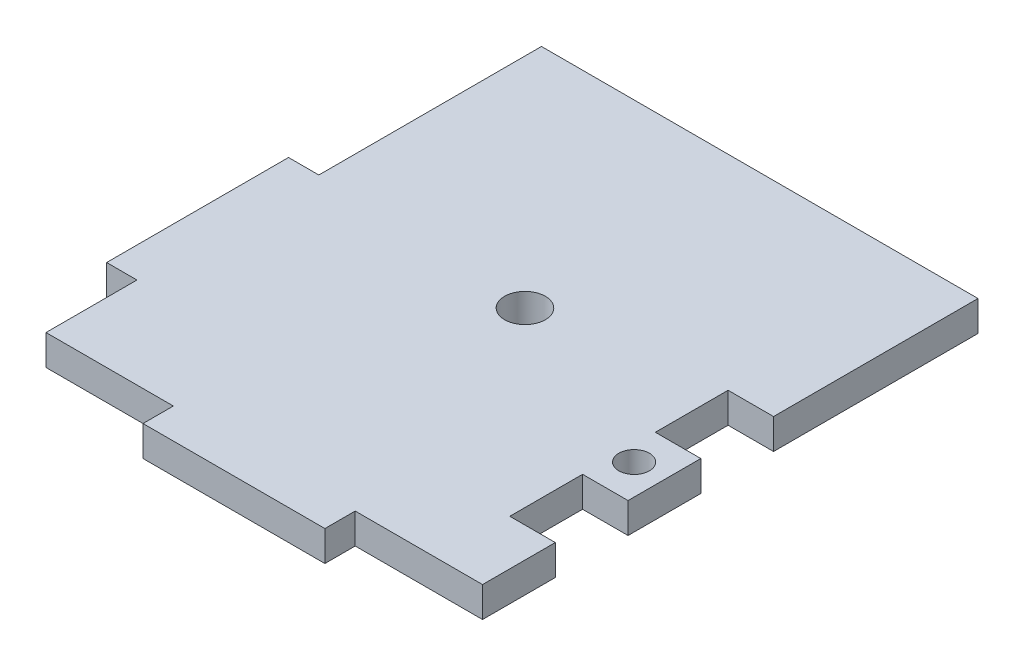
ISO-10303-21;
HEADER;
FILE_DESCRIPTION(('STEP AP214'),'2;1');
FILE_NAME('part.step','',(''),(''),'','','');
FILE_SCHEMA(('AUTOMOTIVE_DESIGN { 1 0 10303 214 1 1 1 1 }'));
ENDSEC;
DATA;
#1=APPLICATION_CONTEXT('core data for automotive mechanical design processes');
#2=APPLICATION_PROTOCOL_DEFINITION('international standard','automotive_design',2000,#1);
#3=PRODUCT_CONTEXT('',#1,'mechanical');
#4=PRODUCT('Part','Part','',(#3));
#5=PRODUCT_RELATED_PRODUCT_CATEGORY('part','',(#4));
#6=PRODUCT_DEFINITION_FORMATION('','',#4);
#7=PRODUCT_DEFINITION_CONTEXT('part definition',#1,'design');
#8=PRODUCT_DEFINITION('design','',#6,#7);
#9=PRODUCT_DEFINITION_SHAPE('','',#8);
#10=(LENGTH_UNIT() NAMED_UNIT(*) SI_UNIT(.MILLI.,.METRE.));
#11=(NAMED_UNIT(*) PLANE_ANGLE_UNIT() SI_UNIT($,.RADIAN.));
#12=(NAMED_UNIT(*) SI_UNIT($,.STERADIAN.) SOLID_ANGLE_UNIT());
#13=UNCERTAINTY_MEASURE_WITH_UNIT(LENGTH_MEASURE(1.E-05),#10,'distance_accuracy_value','');
#14=(GEOMETRIC_REPRESENTATION_CONTEXT(3) GLOBAL_UNCERTAINTY_ASSIGNED_CONTEXT((#13)) GLOBAL_UNIT_ASSIGNED_CONTEXT((#10,
#11,#12)) REPRESENTATION_CONTEXT('',''));
#15=CARTESIAN_POINT('',(0.,0.,0.));
#16=DIRECTION('',(0.,0.,1.));
#17=DIRECTION('',(1.,0.,0.));
#18=AXIS2_PLACEMENT_3D('',#15,#16,#17);
#19=CARTESIAN_POINT('',(0.,3.175,-9.525));
#20=DIRECTION('',(1.,0.,0.));
#21=DIRECTION('',(0.,0.,-1.));
#22=AXIS2_PLACEMENT_3D('',#19,#20,#21);
#23=PLANE('',#22);
#24=DIRECTION('',(0.,0.,1.));
#25=VECTOR('',#24,1.);
#26=CARTESIAN_POINT('',(0.,0.,-9.525));
#27=LINE('',#26,#25);
#28=CARTESIAN_POINT('',(0.,0.,-9.525));
#29=VERTEX_POINT('',#28);
#30=CARTESIAN_POINT('',(0.,0.,0.));
#31=VERTEX_POINT('',#30);
#32=EDGE_CURVE('E201',#29,#31,#27,.T.);
#33=ORIENTED_EDGE('',*,*,#32,.T.);
#34=DIRECTION('',(0.,-1.,0.));
#35=VECTOR('',#34,1.);
#36=CARTESIAN_POINT('',(0.,3.175,0.));
#37=LINE('',#36,#35);
#38=CARTESIAN_POINT('',(0.,3.175,0.));
#39=VERTEX_POINT('',#38);
#40=EDGE_CURVE('E11',#39,#31,#37,.T.);
#41=ORIENTED_EDGE('',*,*,#40,.F.);
#42=DIRECTION('',(0.,0.,1.));
#43=VECTOR('',#42,1.);
#44=CARTESIAN_POINT('',(0.,3.175,-9.525));
#45=LINE('',#44,#43);
#46=CARTESIAN_POINT('',(0.,3.175,-9.525));
#47=VERTEX_POINT('',#46);
#48=EDGE_CURVE('E240',#47,#39,#45,.T.);
#49=ORIENTED_EDGE('',*,*,#48,.F.);
#50=DIRECTION('',(0.,-1.,0.));
#51=VECTOR('',#50,1.);
#52=CARTESIAN_POINT('',(0.,3.175,-9.525));
#53=LINE('',#52,#51);
#54=EDGE_CURVE('E197',#47,#29,#53,.T.);
#55=ORIENTED_EDGE('',*,*,#54,.T.);
#56=EDGE_LOOP('',(#33,#41,#49,#55));
#57=FACE_BOUND('',#56,.T.);
#58=ADVANCED_FACE('F33',(#57),#23,.F.);
#59=CARTESIAN_POINT('',(0.,3.175,0.));
#60=DIRECTION('',(0.,0.,-1.));
#61=DIRECTION('',(-1.,0.,0.));
#62=AXIS2_PLACEMENT_3D('',#59,#60,#61);
#63=PLANE('',#62);
#64=DIRECTION('',(1.,0.,0.));
#65=VECTOR('',#64,1.);
#66=CARTESIAN_POINT('',(0.,0.,0.));
#67=LINE('',#66,#65);
#68=CARTESIAN_POINT('',(13.335,0.,0.));
#69=VERTEX_POINT('',#68);
#70=EDGE_CURVE('E204',#31,#69,#67,.T.);
#71=ORIENTED_EDGE('',*,*,#70,.T.);
#72=DIRECTION('',(0.,-1.,0.));
#73=VECTOR('',#72,1.);
#74=CARTESIAN_POINT('',(13.335,3.175,0.));
#75=LINE('',#74,#73);
#76=CARTESIAN_POINT('',(13.335,3.175,0.));
#77=VERTEX_POINT('',#76);
#78=EDGE_CURVE('E41',#77,#69,#75,.T.);
#79=ORIENTED_EDGE('',*,*,#78,.F.);
#80=DIRECTION('',(1.,0.,0.));
#81=VECTOR('',#80,1.);
#82=CARTESIAN_POINT('',(0.,3.175,0.));
#83=LINE('',#82,#81);
#84=EDGE_CURVE('E128',#39,#77,#83,.T.);
#85=ORIENTED_EDGE('',*,*,#84,.F.);
#86=ORIENTED_EDGE('',*,*,#40,.T.);
#87=EDGE_LOOP('',(#71,#79,#85,#86));
#88=FACE_BOUND('',#87,.T.);
#89=ADVANCED_FACE('F359',(#88),#63,.F.);
#90=CARTESIAN_POINT('',(13.335,3.175,0.));
#91=DIRECTION('',(1.,0.,0.));
#92=DIRECTION('',(0.,0.,-1.));
#93=AXIS2_PLACEMENT_3D('',#90,#91,#92);
#94=PLANE('',#93);
#95=DIRECTION('',(0.,0.,1.));
#96=VECTOR('',#95,1.);
#97=CARTESIAN_POINT('',(13.335,0.,0.));
#98=LINE('',#97,#96);
#99=CARTESIAN_POINT('',(13.335,0.,3.175));
#100=VERTEX_POINT('',#99);
#101=EDGE_CURVE('E207',#69,#100,#98,.T.);
#102=ORIENTED_EDGE('',*,*,#101,.T.);
#103=DIRECTION('',(0.,-1.,0.));
#104=VECTOR('',#103,1.);
#105=CARTESIAN_POINT('',(13.335,3.175,3.175));
#106=LINE('',#105,#104);
#107=CARTESIAN_POINT('',(13.335,3.175,3.175));
#108=VERTEX_POINT('',#107);
#109=EDGE_CURVE('E283',#108,#100,#106,.T.);
#110=ORIENTED_EDGE('',*,*,#109,.F.);
#111=DIRECTION('',(0.,0.,1.));
#112=VECTOR('',#111,1.);
#113=CARTESIAN_POINT('',(13.335,3.175,0.));
#114=LINE('',#113,#112);
#115=EDGE_CURVE('E291',#77,#108,#114,.T.);
#116=ORIENTED_EDGE('',*,*,#115,.F.);
#117=ORIENTED_EDGE('',*,*,#78,.T.);
#118=EDGE_LOOP('',(#102,#110,#116,#117));
#119=FACE_BOUND('',#118,.T.);
#120=ADVANCED_FACE('F289',(#119),#94,.F.);
#121=CARTESIAN_POINT('',(13.335,3.175,3.175));
#122=DIRECTION('',(0.,0.,-1.));
#123=DIRECTION('',(-1.,0.,0.));
#124=AXIS2_PLACEMENT_3D('',#121,#122,#123);
#125=PLANE('',#124);
#126=DIRECTION('',(1.,0.,0.));
#127=VECTOR('',#126,1.);
#128=CARTESIAN_POINT('',(13.335,0.,3.175));
#129=LINE('',#128,#127);
#130=CARTESIAN_POINT('',(32.385,0.,3.175));
#131=VERTEX_POINT('',#130);
#132=EDGE_CURVE('E209',#100,#131,#129,.T.);
#133=ORIENTED_EDGE('',*,*,#132,.T.);
#134=DIRECTION('',(0.,-1.,0.));
#135=VECTOR('',#134,1.);
#136=CARTESIAN_POINT('',(32.385,3.175,3.175));
#137=LINE('',#136,#135);
#138=CARTESIAN_POINT('',(32.385,3.175,3.175));
#139=VERTEX_POINT('',#138);
#140=EDGE_CURVE('E280',#139,#131,#137,.T.);
#141=ORIENTED_EDGE('',*,*,#140,.F.);
#142=DIRECTION('',(1.,0.,0.));
#143=VECTOR('',#142,1.);
#144=CARTESIAN_POINT('',(13.335,3.175,3.175));
#145=LINE('',#144,#143);
#146=EDGE_CURVE('E309',#108,#139,#145,.T.);
#147=ORIENTED_EDGE('',*,*,#146,.F.);
#148=ORIENTED_EDGE('',*,*,#109,.T.);
#149=EDGE_LOOP('',(#133,#141,#147,#148));
#150=FACE_BOUND('',#149,.T.);
#151=ADVANCED_FACE('F300',(#150),#125,.F.);
#152=CARTESIAN_POINT('',(32.385,3.175,3.175));
#153=DIRECTION('',(-1.,0.,0.));
#154=DIRECTION('',(0.,0.,1.));
#155=AXIS2_PLACEMENT_3D('',#152,#153,#154);
#156=PLANE('',#155);
#157=DIRECTION('',(0.,0.,-1.));
#158=VECTOR('',#157,1.);
#159=CARTESIAN_POINT('',(32.385,0.,3.175));
#160=LINE('',#159,#158);
#161=CARTESIAN_POINT('',(32.385,0.,0.));
#162=VERTEX_POINT('',#161);
#163=EDGE_CURVE('E211',#131,#162,#160,.T.);
#164=ORIENTED_EDGE('',*,*,#163,.T.);
#165=DIRECTION('',(0.,-1.,0.));
#166=VECTOR('',#165,1.);
#167=CARTESIAN_POINT('',(32.385,3.175,0.));
#168=LINE('',#167,#166);
#169=CARTESIAN_POINT('',(32.385,3.175,0.));
#170=VERTEX_POINT('',#169);
#171=EDGE_CURVE('E277',#170,#162,#168,.T.);
#172=ORIENTED_EDGE('',*,*,#171,.F.);
#173=DIRECTION('',(0.,0.,-1.));
#174=VECTOR('',#173,1.);
#175=CARTESIAN_POINT('',(32.385,3.175,3.175));
#176=LINE('',#175,#174);
#177=EDGE_CURVE('E306',#139,#170,#176,.T.);
#178=ORIENTED_EDGE('',*,*,#177,.F.);
#179=ORIENTED_EDGE('',*,*,#140,.T.);
#180=EDGE_LOOP('',(#164,#172,#178,#179));
#181=FACE_BOUND('',#180,.T.);
#182=ADVANCED_FACE('F304',(#181),#156,.F.);
#183=CARTESIAN_POINT('',(32.385,3.175,0.));
#184=DIRECTION('',(0.,0.,-1.));
#185=DIRECTION('',(-1.,0.,0.));
#186=AXIS2_PLACEMENT_3D('',#183,#184,#185);
#187=PLANE('',#186);
#188=DIRECTION('',(1.,0.,0.));
#189=VECTOR('',#188,1.);
#190=CARTESIAN_POINT('',(32.385,0.,0.));
#191=LINE('',#190,#189);
#192=CARTESIAN_POINT('',(45.72,0.,0.));
#193=VERTEX_POINT('',#192);
#194=EDGE_CURVE('E213',#162,#193,#191,.T.);
#195=ORIENTED_EDGE('',*,*,#194,.T.);
#196=DIRECTION('',(0.,-1.,0.));
#197=VECTOR('',#196,1.);
#198=CARTESIAN_POINT('',(45.72,3.175,0.));
#199=LINE('',#198,#197);
#200=CARTESIAN_POINT('',(45.72,3.175,0.));
#201=VERTEX_POINT('',#200);
#202=EDGE_CURVE('E274',#201,#193,#199,.T.);
#203=ORIENTED_EDGE('',*,*,#202,.F.);
#204=DIRECTION('',(1.,0.,0.));
#205=VECTOR('',#204,1.);
#206=CARTESIAN_POINT('',(32.385,3.175,0.));
#207=LINE('',#206,#205);
#208=EDGE_CURVE('E308',#170,#201,#207,.T.);
#209=ORIENTED_EDGE('',*,*,#208,.F.);
#210=ORIENTED_EDGE('',*,*,#171,.T.);
#211=EDGE_LOOP('',(#195,#203,#209,#210));
#212=FACE_BOUND('',#211,.T.);
#213=ADVANCED_FACE('F372',(#212),#187,.F.);
#214=CARTESIAN_POINT('',(45.72,3.175,0.));
#215=DIRECTION('',(-1.,0.,0.));
#216=DIRECTION('',(0.,0.,1.));
#217=AXIS2_PLACEMENT_3D('',#214,#215,#216);
#218=PLANE('',#217);
#219=DIRECTION('',(0.,0.,-1.));
#220=VECTOR('',#219,1.);
#221=CARTESIAN_POINT('',(45.72,0.,0.));
#222=LINE('',#221,#220);
#223=CARTESIAN_POINT('',(45.72,0.,-7.62));
#224=VERTEX_POINT('',#223);
#225=EDGE_CURVE('E215',#193,#224,#222,.T.);
#226=ORIENTED_EDGE('',*,*,#225,.T.);
#227=DIRECTION('',(0.,-1.,0.));
#228=VECTOR('',#227,1.);
#229=CARTESIAN_POINT('',(45.72,3.175,-7.62));
#230=LINE('',#229,#228);
#231=CARTESIAN_POINT('',(45.72,3.175,-7.62));
#232=VERTEX_POINT('',#231);
#233=EDGE_CURVE('E271',#232,#224,#230,.T.);
#234=ORIENTED_EDGE('',*,*,#233,.F.);
#235=DIRECTION('',(0.,0.,-1.));
#236=VECTOR('',#235,1.);
#237=CARTESIAN_POINT('',(45.72,3.175,0.));
#238=LINE('',#237,#236);
#239=EDGE_CURVE('E311',#201,#232,#238,.T.);
#240=ORIENTED_EDGE('',*,*,#239,.F.);
#241=ORIENTED_EDGE('',*,*,#202,.T.);
#242=EDGE_LOOP('',(#226,#234,#240,#241));
#243=FACE_BOUND('',#242,.T.);
#244=ADVANCED_FACE('F375',(#243),#218,.F.);
#245=CARTESIAN_POINT('',(40.9575,3.175,-7.62));
#246=DIRECTION('',(0.,0.,1.));
#247=DIRECTION('',(1.,0.,0.));
#248=AXIS2_PLACEMENT_3D('',#245,#246,#247);
#249=PLANE('',#248);
#250=DIRECTION('',(-1.,0.,0.));
#251=VECTOR('',#250,1.);
#252=CARTESIAN_POINT('',(40.9575,0.,-7.62));
#253=LINE('',#252,#251);
#254=CARTESIAN_POINT('',(40.9575,0.,-7.62));
#255=VERTEX_POINT('',#254);
#256=EDGE_CURVE('E217',#224,#255,#253,.T.);
#257=ORIENTED_EDGE('',*,*,#256,.T.);
#258=DIRECTION('',(0.,-1.,0.));
#259=VECTOR('',#258,1.);
#260=CARTESIAN_POINT('',(40.9575,3.175,-7.62));
#261=LINE('',#260,#259);
#262=CARTESIAN_POINT('',(40.9575,3.175,-7.62));
#263=VERTEX_POINT('',#262);
#264=EDGE_CURVE('E268',#263,#255,#261,.T.);
#265=ORIENTED_EDGE('',*,*,#264,.F.);
#266=DIRECTION('',(-1.,0.,0.));
#267=VECTOR('',#266,1.);
#268=CARTESIAN_POINT('',(40.9575,3.175,-7.62));
#269=LINE('',#268,#267);
#270=EDGE_CURVE('E317',#232,#263,#269,.T.);
#271=ORIENTED_EDGE('',*,*,#270,.F.);
#272=ORIENTED_EDGE('',*,*,#233,.T.);
#273=EDGE_LOOP('',(#257,#265,#271,#272));
#274=FACE_BOUND('',#273,.T.);
#275=ADVANCED_FACE('F379',(#274),#249,.F.);
#276=CARTESIAN_POINT('',(40.9575,3.175,-15.24));
#277=DIRECTION('',(-1.,0.,0.));
#278=DIRECTION('',(0.,0.,1.));
#279=AXIS2_PLACEMENT_3D('',#276,#277,#278);
#280=PLANE('',#279);
#281=DIRECTION('',(0.,0.,-1.));
#282=VECTOR('',#281,1.);
#283=CARTESIAN_POINT('',(40.9575,0.,-15.24));
#284=LINE('',#283,#282);
#285=CARTESIAN_POINT('',(40.9575,0.,-15.24));
#286=VERTEX_POINT('',#285);
#287=EDGE_CURVE('E219',#255,#286,#284,.T.);
#288=ORIENTED_EDGE('',*,*,#287,.T.);
#289=DIRECTION('',(0.,-1.,0.));
#290=VECTOR('',#289,1.);
#291=CARTESIAN_POINT('',(40.9575,3.175,-15.24));
#292=LINE('',#291,#290);
#293=CARTESIAN_POINT('',(40.9575,3.175,-15.24));
#294=VERTEX_POINT('',#293);
#295=EDGE_CURVE('E265',#294,#286,#292,.T.);
#296=ORIENTED_EDGE('',*,*,#295,.F.);
#297=DIRECTION('',(0.,0.,-1.));
#298=VECTOR('',#297,1.);
#299=CARTESIAN_POINT('',(40.9575,3.175,-15.24));
#300=LINE('',#299,#298);
#301=EDGE_CURVE('E319',#263,#294,#300,.T.);
#302=ORIENTED_EDGE('',*,*,#301,.F.);
#303=ORIENTED_EDGE('',*,*,#264,.T.);
#304=EDGE_LOOP('',(#288,#296,#302,#303));
#305=FACE_BOUND('',#304,.T.);
#306=ADVANCED_FACE('F383',(#305),#280,.F.);
#307=CARTESIAN_POINT('',(40.9575,3.175,-15.24));
#308=DIRECTION('',(0.,0.,-1.));
#309=DIRECTION('',(-1.,0.,0.));
#310=AXIS2_PLACEMENT_3D('',#307,#308,#309);
#311=PLANE('',#310);
#312=DIRECTION('',(1.,0.,0.));
#313=VECTOR('',#312,1.);
#314=CARTESIAN_POINT('',(40.9575,0.,-15.24));
#315=LINE('',#314,#313);
#316=CARTESIAN_POINT('',(45.72,0.,-15.24));
#317=VERTEX_POINT('',#316);
#318=EDGE_CURVE('E221',#286,#317,#315,.T.);
#319=ORIENTED_EDGE('',*,*,#318,.T.);
#320=DIRECTION('',(0.,-1.,0.));
#321=VECTOR('',#320,1.);
#322=CARTESIAN_POINT('',(45.72,3.175,-15.24));
#323=LINE('',#322,#321);
#324=CARTESIAN_POINT('',(45.72,3.175,-15.24));
#325=VERTEX_POINT('',#324);
#326=EDGE_CURVE('E262',#325,#317,#323,.T.);
#327=ORIENTED_EDGE('',*,*,#326,.F.);
#328=DIRECTION('',(1.,0.,0.));
#329=VECTOR('',#328,1.);
#330=CARTESIAN_POINT('',(40.9575,3.175,-15.24));
#331=LINE('',#330,#329);
#332=EDGE_CURVE('E321',#294,#325,#331,.T.);
#333=ORIENTED_EDGE('',*,*,#332,.F.);
#334=ORIENTED_EDGE('',*,*,#295,.T.);
#335=EDGE_LOOP('',(#319,#327,#333,#334));
#336=FACE_BOUND('',#335,.T.);
#337=ADVANCED_FACE('F387',(#336),#311,.F.);
#338=CARTESIAN_POINT('',(45.72,3.175,-15.24));
#339=DIRECTION('',(-1.,0.,0.));
#340=DIRECTION('',(0.,0.,1.));
#341=AXIS2_PLACEMENT_3D('',#338,#339,#340);
#342=PLANE('',#341);
#343=DIRECTION('',(0.,0.,-1.));
#344=VECTOR('',#343,1.);
#345=CARTESIAN_POINT('',(45.72,0.,-15.24));
#346=LINE('',#345,#344);
#347=CARTESIAN_POINT('',(45.72,0.,-22.86));
#348=VERTEX_POINT('',#347);
#349=EDGE_CURVE('E223',#317,#348,#346,.T.);
#350=ORIENTED_EDGE('',*,*,#349,.T.);
#351=DIRECTION('',(0.,-1.,0.));
#352=VECTOR('',#351,1.);
#353=CARTESIAN_POINT('',(45.72,3.175,-22.86));
#354=LINE('',#353,#352);
#355=CARTESIAN_POINT('',(45.72,3.175,-22.86));
#356=VERTEX_POINT('',#355);
#357=EDGE_CURVE('E259',#356,#348,#354,.T.);
#358=ORIENTED_EDGE('',*,*,#357,.F.);
#359=DIRECTION('',(0.,0.,-1.));
#360=VECTOR('',#359,1.);
#361=CARTESIAN_POINT('',(45.72,3.175,-15.24));
#362=LINE('',#361,#360);
#363=EDGE_CURVE('E323',#325,#356,#362,.T.);
#364=ORIENTED_EDGE('',*,*,#363,.F.);
#365=ORIENTED_EDGE('',*,*,#326,.T.);
#366=EDGE_LOOP('',(#350,#358,#364,#365));
#367=FACE_BOUND('',#366,.T.);
#368=ADVANCED_FACE('F391',(#367),#342,.F.);
#369=CARTESIAN_POINT('',(40.9575,3.175,-22.86));
#370=DIRECTION('',(0.,0.,1.));
#371=DIRECTION('',(1.,0.,0.));
#372=AXIS2_PLACEMENT_3D('',#369,#370,#371);
#373=PLANE('',#372);
#374=DIRECTION('',(-1.,0.,0.));
#375=VECTOR('',#374,1.);
#376=CARTESIAN_POINT('',(40.9575,0.,-22.86));
#377=LINE('',#376,#375);
#378=CARTESIAN_POINT('',(40.9575,0.,-22.86));
#379=VERTEX_POINT('',#378);
#380=EDGE_CURVE('E225',#348,#379,#377,.T.);
#381=ORIENTED_EDGE('',*,*,#380,.T.);
#382=DIRECTION('',(0.,-1.,0.));
#383=VECTOR('',#382,1.);
#384=CARTESIAN_POINT('',(40.9575,3.175,-22.86));
#385=LINE('',#384,#383);
#386=CARTESIAN_POINT('',(40.9575,3.175,-22.86));
#387=VERTEX_POINT('',#386);
#388=EDGE_CURVE('E256',#387,#379,#385,.T.);
#389=ORIENTED_EDGE('',*,*,#388,.F.);
#390=DIRECTION('',(-1.,0.,0.));
#391=VECTOR('',#390,1.);
#392=CARTESIAN_POINT('',(40.9575,3.175,-22.86));
#393=LINE('',#392,#391);
#394=EDGE_CURVE('E325',#356,#387,#393,.T.);
#395=ORIENTED_EDGE('',*,*,#394,.F.);
#396=ORIENTED_EDGE('',*,*,#357,.T.);
#397=EDGE_LOOP('',(#381,#389,#395,#396));
#398=FACE_BOUND('',#397,.T.);
#399=ADVANCED_FACE('F395',(#398),#373,.F.);
#400=CARTESIAN_POINT('',(40.9575,3.175,-30.48));
#401=DIRECTION('',(-1.,0.,0.));
#402=DIRECTION('',(0.,0.,1.));
#403=AXIS2_PLACEMENT_3D('',#400,#401,#402);
#404=PLANE('',#403);
#405=DIRECTION('',(0.,0.,-1.));
#406=VECTOR('',#405,1.);
#407=CARTESIAN_POINT('',(40.9575,0.,-30.48));
#408=LINE('',#407,#406);
#409=CARTESIAN_POINT('',(40.9575,0.,-30.48));
#410=VERTEX_POINT('',#409);
#411=EDGE_CURVE('E227',#379,#410,#408,.T.);
#412=ORIENTED_EDGE('',*,*,#411,.T.);
#413=DIRECTION('',(0.,-1.,0.));
#414=VECTOR('',#413,1.);
#415=CARTESIAN_POINT('',(40.9575,3.175,-30.48));
#416=LINE('',#415,#414);
#417=CARTESIAN_POINT('',(40.9575,3.175,-30.48));
#418=VERTEX_POINT('',#417);
#419=EDGE_CURVE('E253',#418,#410,#416,.T.);
#420=ORIENTED_EDGE('',*,*,#419,.F.);
#421=DIRECTION('',(0.,0.,-1.));
#422=VECTOR('',#421,1.);
#423=CARTESIAN_POINT('',(40.9575,3.175,-30.48));
#424=LINE('',#423,#422);
#425=EDGE_CURVE('E327',#387,#418,#424,.T.);
#426=ORIENTED_EDGE('',*,*,#425,.F.);
#427=ORIENTED_EDGE('',*,*,#388,.T.);
#428=EDGE_LOOP('',(#412,#420,#426,#427));
#429=FACE_BOUND('',#428,.T.);
#430=ADVANCED_FACE('F399',(#429),#404,.F.);
#431=CARTESIAN_POINT('',(40.9575,3.175,-30.48));
#432=DIRECTION('',(0.,0.,-1.));
#433=DIRECTION('',(-1.,0.,0.));
#434=AXIS2_PLACEMENT_3D('',#431,#432,#433);
#435=PLANE('',#434);
#436=DIRECTION('',(1.,0.,0.));
#437=VECTOR('',#436,1.);
#438=CARTESIAN_POINT('',(40.9575,0.,-30.48));
#439=LINE('',#438,#437);
#440=CARTESIAN_POINT('',(45.72,0.,-30.48));
#441=VERTEX_POINT('',#440);
#442=EDGE_CURVE('E229',#410,#441,#439,.T.);
#443=ORIENTED_EDGE('',*,*,#442,.T.);
#444=DIRECTION('',(0.,-1.,0.));
#445=VECTOR('',#444,1.);
#446=CARTESIAN_POINT('',(45.72,3.175,-30.48));
#447=LINE('',#446,#445);
#448=CARTESIAN_POINT('',(45.72,3.175,-30.48));
#449=VERTEX_POINT('',#448);
#450=EDGE_CURVE('E250',#449,#441,#447,.T.);
#451=ORIENTED_EDGE('',*,*,#450,.F.);
#452=DIRECTION('',(1.,0.,0.));
#453=VECTOR('',#452,1.);
#454=CARTESIAN_POINT('',(40.9575,3.175,-30.48));
#455=LINE('',#454,#453);
#456=EDGE_CURVE('E329',#418,#449,#455,.T.);
#457=ORIENTED_EDGE('',*,*,#456,.F.);
#458=ORIENTED_EDGE('',*,*,#419,.T.);
#459=EDGE_LOOP('',(#443,#451,#457,#458));
#460=FACE_BOUND('',#459,.T.);
#461=ADVANCED_FACE('F403',(#460),#435,.F.);
#462=CARTESIAN_POINT('',(45.72,3.175,-30.48));
#463=DIRECTION('',(-1.,0.,0.));
#464=DIRECTION('',(0.,0.,1.));
#465=AXIS2_PLACEMENT_3D('',#462,#463,#464);
#466=PLANE('',#465);
#467=DIRECTION('',(0.,0.,-1.));
#468=VECTOR('',#467,1.);
#469=CARTESIAN_POINT('',(45.72,0.,-30.48));
#470=LINE('',#469,#468);
#471=CARTESIAN_POINT('',(45.72,0.,-51.8922));
#472=VERTEX_POINT('',#471);
#473=EDGE_CURVE('E231',#441,#472,#470,.T.);
#474=ORIENTED_EDGE('',*,*,#473,.T.);
#475=DIRECTION('',(0.,-1.,0.));
#476=VECTOR('',#475,1.);
#477=CARTESIAN_POINT('',(45.72,3.175,-51.8922));
#478=LINE('',#477,#476);
#479=CARTESIAN_POINT('',(45.72,3.175,-51.8922));
#480=VERTEX_POINT('',#479);
#481=EDGE_CURVE('E247',#480,#472,#478,.T.);
#482=ORIENTED_EDGE('',*,*,#481,.F.);
#483=DIRECTION('',(0.,0.,-1.));
#484=VECTOR('',#483,1.);
#485=CARTESIAN_POINT('',(45.72,3.175,-30.48));
#486=LINE('',#485,#484);
#487=EDGE_CURVE('E331',#449,#480,#486,.T.);
#488=ORIENTED_EDGE('',*,*,#487,.F.);
#489=ORIENTED_EDGE('',*,*,#450,.T.);
#490=EDGE_LOOP('',(#474,#482,#488,#489));
#491=FACE_BOUND('',#490,.T.);
#492=ADVANCED_FACE('F407',(#491),#466,.F.);
#493=CARTESIAN_POINT('',(45.72,3.175,-51.8922));
#494=DIRECTION('',(0.,0.,1.));
#495=DIRECTION('',(1.,0.,0.));
#496=AXIS2_PLACEMENT_3D('',#493,#494,#495);
#497=PLANE('',#496);
#498=DIRECTION('',(-1.,0.,0.));
#499=VECTOR('',#498,1.);
#500=CARTESIAN_POINT('',(45.72,0.,-51.8922));
#501=LINE('',#500,#499);
#502=CARTESIAN_POINT('',(0.,0.,-51.8922));
#503=VERTEX_POINT('',#502);
#504=EDGE_CURVE('E233',#472,#503,#501,.T.);
#505=ORIENTED_EDGE('',*,*,#504,.T.);
#506=DIRECTION('',(0.,-1.,0.));
#507=VECTOR('',#506,1.);
#508=CARTESIAN_POINT('',(0.,3.175,-51.8922));
#509=LINE('',#508,#507);
#510=CARTESIAN_POINT('',(0.,3.175,-51.8922));
#511=VERTEX_POINT('',#510);
#512=EDGE_CURVE('E244',#511,#503,#509,.T.);
#513=ORIENTED_EDGE('',*,*,#512,.F.);
#514=DIRECTION('',(-1.,0.,0.));
#515=VECTOR('',#514,1.);
#516=CARTESIAN_POINT('',(45.72,3.175,-51.8922));
#517=LINE('',#516,#515);
#518=EDGE_CURVE('E333',#480,#511,#517,.T.);
#519=ORIENTED_EDGE('',*,*,#518,.F.);
#520=ORIENTED_EDGE('',*,*,#481,.T.);
#521=EDGE_LOOP('',(#505,#513,#519,#520));
#522=FACE_BOUND('',#521,.T.);
#523=ADVANCED_FACE('F339',(#522),#497,.F.);
#524=CARTESIAN_POINT('',(0.,3.175,-51.8922));
#525=DIRECTION('',(1.,0.,0.));
#526=DIRECTION('',(0.,0.,-1.));
#527=AXIS2_PLACEMENT_3D('',#524,#525,#526);
#528=PLANE('',#527);
#529=DIRECTION('',(0.,0.,1.));
#530=VECTOR('',#529,1.);
#531=CARTESIAN_POINT('',(0.,0.,-51.8922));
#532=LINE('',#531,#530);
#533=CARTESIAN_POINT('',(0.,0.,-28.575));
#534=VERTEX_POINT('',#533);
#535=EDGE_CURVE('E235',#503,#534,#532,.T.);
#536=ORIENTED_EDGE('',*,*,#535,.T.);
#537=DIRECTION('',(0.,-1.,0.));
#538=VECTOR('',#537,1.);
#539=CARTESIAN_POINT('',(0.,3.175,-28.575));
#540=LINE('',#539,#538);
#541=CARTESIAN_POINT('',(0.,3.175,-28.575));
#542=VERTEX_POINT('',#541);
#543=EDGE_CURVE('E192',#542,#534,#540,.T.);
#544=ORIENTED_EDGE('',*,*,#543,.F.);
#545=DIRECTION('',(0.,0.,1.));
#546=VECTOR('',#545,1.);
#547=CARTESIAN_POINT('',(0.,3.175,-51.8922));
#548=LINE('',#547,#546);
#549=EDGE_CURVE('E183',#511,#542,#548,.T.);
#550=ORIENTED_EDGE('',*,*,#549,.F.);
#551=ORIENTED_EDGE('',*,*,#512,.T.);
#552=EDGE_LOOP('',(#536,#544,#550,#551));
#553=FACE_BOUND('',#552,.T.);
#554=ADVANCED_FACE('F343',(#553),#528,.F.);
#555=CARTESIAN_POINT('',(0.,3.175,-28.575));
#556=DIRECTION('',(0.,0.,1.));
#557=DIRECTION('',(1.,0.,0.));
#558=AXIS2_PLACEMENT_3D('',#555,#556,#557);
#559=PLANE('',#558);
#560=DIRECTION('',(-1.,0.,0.));
#561=VECTOR('',#560,1.);
#562=CARTESIAN_POINT('',(0.,0.,-28.575));
#563=LINE('',#562,#561);
#564=CARTESIAN_POINT('',(-3.175,0.,-28.575));
#565=VERTEX_POINT('',#564);
#566=EDGE_CURVE('E191',#534,#565,#563,.T.);
#567=ORIENTED_EDGE('',*,*,#566,.T.);
#568=DIRECTION('',(0.,-1.,0.));
#569=VECTOR('',#568,1.);
#570=CARTESIAN_POINT('',(-3.175,3.175,-28.575));
#571=LINE('',#570,#569);
#572=CARTESIAN_POINT('',(-3.175,3.175,-28.575));
#573=VERTEX_POINT('',#572);
#574=EDGE_CURVE('E188',#573,#565,#571,.T.);
#575=ORIENTED_EDGE('',*,*,#574,.F.);
#576=DIRECTION('',(-1.,0.,0.));
#577=VECTOR('',#576,1.);
#578=CARTESIAN_POINT('',(0.,3.175,-28.575));
#579=LINE('',#578,#577);
#580=EDGE_CURVE('E177',#542,#573,#579,.T.);
#581=ORIENTED_EDGE('',*,*,#580,.F.);
#582=ORIENTED_EDGE('',*,*,#543,.T.);
#583=EDGE_LOOP('',(#567,#575,#581,#582));
#584=FACE_BOUND('',#583,.T.);
#585=ADVANCED_FACE('F189',(#584),#559,.F.);
#586=CARTESIAN_POINT('',(-3.175,3.175,-28.575));
#587=DIRECTION('',(1.,0.,0.));
#588=DIRECTION('',(0.,0.,-1.));
#589=AXIS2_PLACEMENT_3D('',#586,#587,#588);
#590=PLANE('',#589);
#591=DIRECTION('',(0.,0.,1.));
#592=VECTOR('',#591,1.);
#593=CARTESIAN_POINT('',(-3.175,0.,-28.575));
#594=LINE('',#593,#592);
#595=CARTESIAN_POINT('',(-3.17499999999999,0.,-9.525));
#596=VERTEX_POINT('',#595);
#597=EDGE_CURVE('E114',#565,#596,#594,.T.);
#598=ORIENTED_EDGE('',*,*,#597,.T.);
#599=DIRECTION('',(0.,-1.,0.));
#600=VECTOR('',#599,1.);
#601=CARTESIAN_POINT('',(-3.17499999999999,3.175,-9.525));
#602=LINE('',#601,#600);
#603=CARTESIAN_POINT('',(-3.17499999999999,3.175,-9.525));
#604=VERTEX_POINT('',#603);
#605=EDGE_CURVE('E193',#604,#596,#602,.T.);
#606=ORIENTED_EDGE('',*,*,#605,.F.);
#607=DIRECTION('',(0.,0.,1.));
#608=VECTOR('',#607,1.);
#609=CARTESIAN_POINT('',(-3.175,3.175,-28.575));
#610=LINE('',#609,#608);
#611=EDGE_CURVE('E181',#573,#604,#610,.T.);
#612=ORIENTED_EDGE('',*,*,#611,.F.);
#613=ORIENTED_EDGE('',*,*,#574,.T.);
#614=EDGE_LOOP('',(#598,#606,#612,#613));
#615=FACE_BOUND('',#614,.T.);
#616=ADVANCED_FACE('F195',(#615),#590,.F.);
#617=CARTESIAN_POINT('',(-3.17499999999999,3.175,-9.525));
#618=DIRECTION('',(0.,0.,-1.));
#619=DIRECTION('',(-1.,0.,0.));
#620=AXIS2_PLACEMENT_3D('',#617,#618,#619);
#621=PLANE('',#620);
#622=DIRECTION('',(1.,0.,0.));
#623=VECTOR('',#622,1.);
#624=CARTESIAN_POINT('',(-3.17499999999999,0.,-9.525));
#625=LINE('',#624,#623);
#626=EDGE_CURVE('E120',#596,#29,#625,.T.);
#627=ORIENTED_EDGE('',*,*,#626,.T.);
#628=ORIENTED_EDGE('',*,*,#54,.F.);
#629=DIRECTION('',(1.,0.,0.));
#630=VECTOR('',#629,1.);
#631=CARTESIAN_POINT('',(-3.17499999999999,3.175,-9.525));
#632=LINE('',#631,#630);
#633=EDGE_CURVE('E49',#604,#47,#632,.T.);
#634=ORIENTED_EDGE('',*,*,#633,.F.);
#635=ORIENTED_EDGE('',*,*,#605,.T.);
#636=EDGE_LOOP('',(#627,#628,#634,#635));
#637=FACE_BOUND('',#636,.T.);
#638=ADVANCED_FACE('F347',(#637),#621,.F.);
#639=CARTESIAN_POINT('',(0.,3.175,0.));
#640=DIRECTION('',(0.,1.,0.));
#641=DIRECTION('',(0.,0.,1.));
#642=AXIS2_PLACEMENT_3D('',#639,#640,#641);
#643=PLANE('',#642);
#644=CARTESIAN_POINT('',(22.86,3.175,-27.305));
#645=DIRECTION('',(0.,1.,0.));
#646=DIRECTION('',(0.,0.,1.));
#647=AXIS2_PLACEMENT_3D('',#644,#645,#646);
#648=CIRCLE('',#647,2.13359999999999);
#649=CARTESIAN_POINT('',(22.86,3.175,-25.1714));
#650=VERTEX_POINT('',#649);
#651=EDGE_CURVE('E477',#650,#650,#648,.T.);
#652=ORIENTED_EDGE('',*,*,#651,.F.);
#653=EDGE_LOOP('',(#652));
#654=FACE_BOUND('',#653,.T.);
#655=CARTESIAN_POINT('',(42.545,3.175,-19.05));
#656=DIRECTION('',(0.,1.,0.));
#657=DIRECTION('',(0.,0.,1.));
#658=AXIS2_PLACEMENT_3D('',#655,#656,#657);
#659=CIRCLE('',#658,1.6);
#660=CARTESIAN_POINT('',(42.545,3.175,-17.45));
#661=VERTEX_POINT('',#660);
#662=EDGE_CURVE('E479',#661,#661,#659,.T.);
#663=ORIENTED_EDGE('',*,*,#662,.F.);
#664=EDGE_LOOP('',(#663));
#665=FACE_BOUND('',#664,.T.);
#666=ORIENTED_EDGE('',*,*,#48,.T.);
#667=ORIENTED_EDGE('',*,*,#84,.T.);
#668=ORIENTED_EDGE('',*,*,#115,.T.);
#669=ORIENTED_EDGE('',*,*,#146,.T.);
#670=ORIENTED_EDGE('',*,*,#177,.T.);
#671=ORIENTED_EDGE('',*,*,#208,.T.);
#672=ORIENTED_EDGE('',*,*,#239,.T.);
#673=ORIENTED_EDGE('',*,*,#270,.T.);
#674=ORIENTED_EDGE('',*,*,#301,.T.);
#675=ORIENTED_EDGE('',*,*,#332,.T.);
#676=ORIENTED_EDGE('',*,*,#363,.T.);
#677=ORIENTED_EDGE('',*,*,#394,.T.);
#678=ORIENTED_EDGE('',*,*,#425,.T.);
#679=ORIENTED_EDGE('',*,*,#456,.T.);
#680=ORIENTED_EDGE('',*,*,#487,.T.);
#681=ORIENTED_EDGE('',*,*,#518,.T.);
#682=ORIENTED_EDGE('',*,*,#549,.T.);
#683=ORIENTED_EDGE('',*,*,#580,.T.);
#684=ORIENTED_EDGE('',*,*,#611,.T.);
#685=ORIENTED_EDGE('',*,*,#633,.T.);
#686=EDGE_LOOP('',(#666,#667,#668,#669,#670,#671,#672,#673,#674,#675,#676,#677,#678,#679,#680,
#681,#682,#683,#684,#685));
#687=FACE_BOUND('',#686,.T.);
#688=ADVANCED_FACE('F179',(#654,#665,#687),#643,.T.);
#689=CARTESIAN_POINT('',(0.,0.,0.));
#690=DIRECTION('',(0.,1.,0.));
#691=DIRECTION('',(0.,0.,1.));
#692=AXIS2_PLACEMENT_3D('',#689,#690,#691);
#693=PLANE('',#692);
#694=CARTESIAN_POINT('',(22.86,0.,-27.305));
#695=DIRECTION('',(0.,1.,0.));
#696=DIRECTION('',(0.,0.,1.));
#697=AXIS2_PLACEMENT_3D('',#694,#695,#696);
#698=CIRCLE('',#697,2.13359999999999);
#699=CARTESIAN_POINT('',(22.86,0.,-25.1714));
#700=VERTEX_POINT('',#699);
#701=EDGE_CURVE('E474',#700,#700,#698,.T.);
#702=ORIENTED_EDGE('',*,*,#701,.T.);
#703=EDGE_LOOP('',(#702));
#704=FACE_BOUND('',#703,.T.);
#705=CARTESIAN_POINT('',(42.545,0.,-19.05));
#706=DIRECTION('',(0.,1.,0.));
#707=DIRECTION('',(0.,0.,1.));
#708=AXIS2_PLACEMENT_3D('',#705,#706,#707);
#709=CIRCLE('',#708,1.6);
#710=CARTESIAN_POINT('',(42.545,0.,-17.45));
#711=VERTEX_POINT('',#710);
#712=EDGE_CURVE('E205',#711,#711,#709,.T.);
#713=ORIENTED_EDGE('',*,*,#712,.T.);
#714=EDGE_LOOP('',(#713));
#715=FACE_BOUND('',#714,.T.);
#716=ORIENTED_EDGE('',*,*,#32,.F.);
#717=ORIENTED_EDGE('',*,*,#626,.F.);
#718=ORIENTED_EDGE('',*,*,#597,.F.);
#719=ORIENTED_EDGE('',*,*,#566,.F.);
#720=ORIENTED_EDGE('',*,*,#535,.F.);
#721=ORIENTED_EDGE('',*,*,#504,.F.);
#722=ORIENTED_EDGE('',*,*,#473,.F.);
#723=ORIENTED_EDGE('',*,*,#442,.F.);
#724=ORIENTED_EDGE('',*,*,#411,.F.);
#725=ORIENTED_EDGE('',*,*,#380,.F.);
#726=ORIENTED_EDGE('',*,*,#349,.F.);
#727=ORIENTED_EDGE('',*,*,#318,.F.);
#728=ORIENTED_EDGE('',*,*,#287,.F.);
#729=ORIENTED_EDGE('',*,*,#256,.F.);
#730=ORIENTED_EDGE('',*,*,#225,.F.);
#731=ORIENTED_EDGE('',*,*,#194,.F.);
#732=ORIENTED_EDGE('',*,*,#163,.F.);
#733=ORIENTED_EDGE('',*,*,#132,.F.);
#734=ORIENTED_EDGE('',*,*,#101,.F.);
#735=ORIENTED_EDGE('',*,*,#70,.F.);
#736=EDGE_LOOP('',(#716,#717,#718,#719,#720,#721,#722,#723,#724,#725,#726,#727,#728,#729,#730,
#731,#732,#733,#734,#735));
#737=FACE_BOUND('',#736,.T.);
#738=ADVANCED_FACE('F295',(#704,#715,#737),#693,.F.);
#739=CARTESIAN_POINT('',(42.545,3.175,-19.05));
#740=DIRECTION('',(0.,1.,0.));
#741=DIRECTION('',(0.,0.,1.));
#742=AXIS2_PLACEMENT_3D('',#739,#740,#741);
#743=CYLINDRICAL_SURFACE('',#742,1.6);
#744=ORIENTED_EDGE('',*,*,#712,.F.);
#745=EDGE_LOOP('',(#744));
#746=FACE_BOUND('',#745,.T.);
#747=ORIENTED_EDGE('',*,*,#662,.T.);
#748=EDGE_LOOP('',(#747));
#749=FACE_BOUND('',#748,.T.);
#750=ADVANCED_FACE('F435',(#746,#749),#743,.F.);
#751=CARTESIAN_POINT('',(22.86,0.,-27.305));
#752=DIRECTION('',(0.,1.,0.));
#753=DIRECTION('',(0.,0.,1.));
#754=AXIS2_PLACEMENT_3D('',#751,#752,#753);
#755=CYLINDRICAL_SURFACE('',#754,2.13359999999999);
#756=ORIENTED_EDGE('',*,*,#701,.F.);
#757=EDGE_LOOP('',(#756));
#758=FACE_BOUND('',#757,.T.);
#759=ORIENTED_EDGE('',*,*,#651,.T.);
#760=EDGE_LOOP('',(#759));
#761=FACE_BOUND('',#760,.T.);
#762=ADVANCED_FACE('F440',(#758,#761),#755,.F.);
#763=CLOSED_SHELL('',(#58,#89,#120,#151,#182,#213,#244,#275,#306,#337,#368,#399,#430,#461,#492,
#523,#554,#585,#616,#638,#688,#738,#750,#762));
#764=MANIFOLD_SOLID_BREP('B2',#763);
#765=ADVANCED_BREP_SHAPE_REPRESENTATION('',(#18,#764),#14);
#766=SHAPE_DEFINITION_REPRESENTATION(#9,#765);
ENDSEC;
END-ISO-10303-21;
